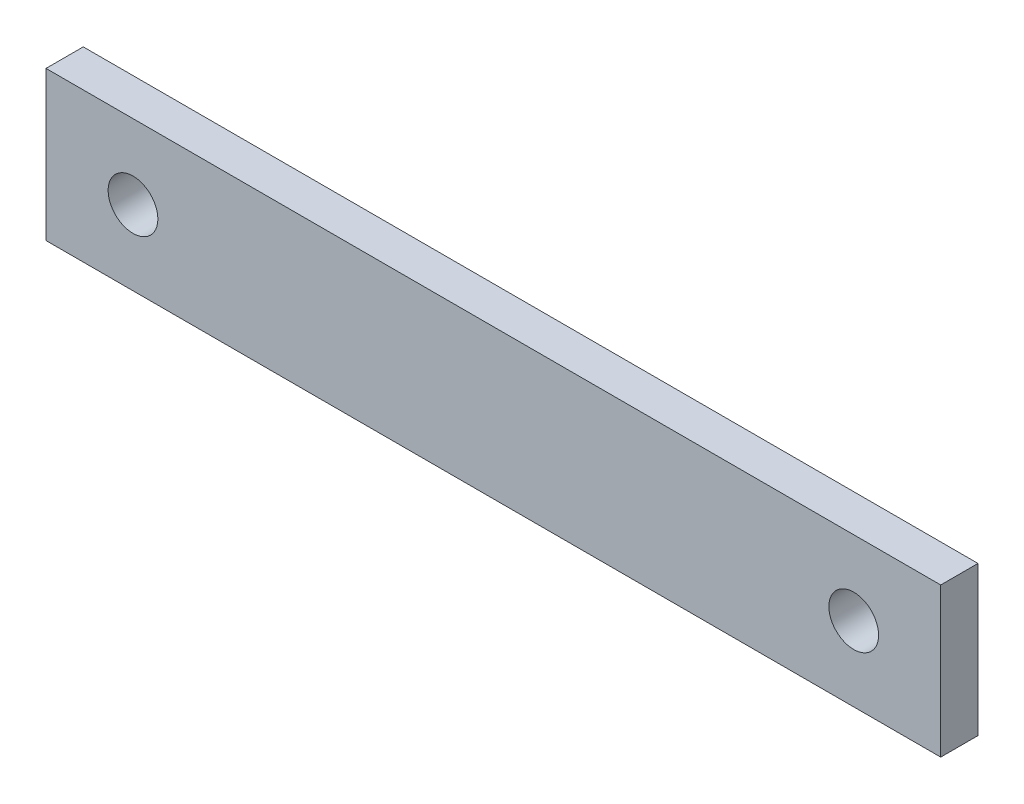
ISO-10303-21;
HEADER;
FILE_DESCRIPTION(('STEP AP214'),'2;1');
FILE_NAME('part.step','',(''),(''),'','','');
FILE_SCHEMA(('AUTOMOTIVE_DESIGN { 1 0 10303 214 1 1 1 1 }'));
ENDSEC;
DATA;
#1=APPLICATION_CONTEXT('core data for automotive mechanical design processes');
#2=APPLICATION_PROTOCOL_DEFINITION('international standard','automotive_design',2000,#1);
#3=PRODUCT_CONTEXT('',#1,'mechanical');
#4=PRODUCT('Part','Part','',(#3));
#5=PRODUCT_RELATED_PRODUCT_CATEGORY('part','',(#4));
#6=PRODUCT_DEFINITION_FORMATION('','',#4);
#7=PRODUCT_DEFINITION_CONTEXT('part definition',#1,'design');
#8=PRODUCT_DEFINITION('design','',#6,#7);
#9=PRODUCT_DEFINITION_SHAPE('','',#8);
#10=(LENGTH_UNIT() NAMED_UNIT(*) SI_UNIT(.MILLI.,.METRE.));
#11=(NAMED_UNIT(*) PLANE_ANGLE_UNIT() SI_UNIT($,.RADIAN.));
#12=(NAMED_UNIT(*) SI_UNIT($,.STERADIAN.) SOLID_ANGLE_UNIT());
#13=UNCERTAINTY_MEASURE_WITH_UNIT(LENGTH_MEASURE(1.E-05),#10,'distance_accuracy_value','');
#14=(GEOMETRIC_REPRESENTATION_CONTEXT(3) GLOBAL_UNCERTAINTY_ASSIGNED_CONTEXT((#13)) GLOBAL_UNIT_ASSIGNED_CONTEXT((#10,
#11,#12)) REPRESENTATION_CONTEXT('',''));
#15=CARTESIAN_POINT('',(0.,0.,0.));
#16=DIRECTION('',(0.,0.,1.));
#17=DIRECTION('',(1.,0.,0.));
#18=AXIS2_PLACEMENT_3D('',#15,#16,#17);
#19=CARTESIAN_POINT('',(-24.595022473353,4.43076923076923,1.8));
#20=DIRECTION('',(1.,0.,0.));
#21=DIRECTION('',(0.,0.,-1.));
#22=AXIS2_PLACEMENT_3D('',#19,#20,#21);
#23=PLANE('',#22);
#24=DIRECTION('',(0.,-1.,0.));
#25=VECTOR('',#24,1.);
#26=CARTESIAN_POINT('',(-24.595022473353,4.43076923076923,0.));
#27=LINE('',#26,#25);
#28=CARTESIAN_POINT('',(-24.595022473353,4.43076923076923,0.));
#29=VERTEX_POINT('',#28);
#30=CARTESIAN_POINT('',(-24.595022473353,-2.76923076923077,0.));
#31=VERTEX_POINT('',#30);
#32=EDGE_CURVE('E96',#29,#31,#27,.T.);
#33=ORIENTED_EDGE('',*,*,#32,.T.);
#34=DIRECTION('',(0.,0.,-1.));
#35=VECTOR('',#34,1.);
#36=CARTESIAN_POINT('',(-24.595022473353,-2.76923076923077,1.8));
#37=LINE('',#36,#35);
#38=CARTESIAN_POINT('',(-24.595022473353,-2.76923076923077,1.8));
#39=VERTEX_POINT('',#38);
#40=EDGE_CURVE('E11',#39,#31,#37,.T.);
#41=ORIENTED_EDGE('',*,*,#40,.F.);
#42=DIRECTION('',(0.,-1.,0.));
#43=VECTOR('',#42,1.);
#44=CARTESIAN_POINT('',(-24.595022473353,4.43076923076923,1.8));
#45=LINE('',#44,#43);
#46=CARTESIAN_POINT('',(-24.595022473353,4.43076923076923,1.8));
#47=VERTEX_POINT('',#46);
#48=EDGE_CURVE('E84',#47,#39,#45,.T.);
#49=ORIENTED_EDGE('',*,*,#48,.F.);
#50=DIRECTION('',(0.,0.,-1.));
#51=VECTOR('',#50,1.);
#52=CARTESIAN_POINT('',(-24.595022473353,4.43076923076923,1.8));
#53=LINE('',#52,#51);
#54=EDGE_CURVE('E92',#47,#29,#53,.T.);
#55=ORIENTED_EDGE('',*,*,#54,.T.);
#56=EDGE_LOOP('',(#33,#41,#49,#55));
#57=FACE_BOUND('',#56,.T.);
#58=ADVANCED_FACE('F33',(#57),#23,.F.);
#59=CARTESIAN_POINT('',(-24.595022473353,-2.76923076923077,1.8));
#60=DIRECTION('',(0.,1.,0.));
#61=DIRECTION('',(0.,0.,1.));
#62=AXIS2_PLACEMENT_3D('',#59,#60,#61);
#63=PLANE('',#62);
#64=DIRECTION('',(1.,0.,0.));
#65=VECTOR('',#64,1.);
#66=CARTESIAN_POINT('',(-24.595022473353,-2.76923076923077,0.));
#67=LINE('',#66,#65);
#68=CARTESIAN_POINT('',(18.604977526647,-2.76923076923077,0.));
#69=VERTEX_POINT('',#68);
#70=EDGE_CURVE('E88',#31,#69,#67,.T.);
#71=ORIENTED_EDGE('',*,*,#70,.T.);
#72=DIRECTION('',(0.,0.,-1.));
#73=VECTOR('',#72,1.);
#74=CARTESIAN_POINT('',(18.604977526647,-2.76923076923077,1.8));
#75=LINE('',#74,#73);
#76=CARTESIAN_POINT('',(18.604977526647,-2.76923076923077,1.8));
#77=VERTEX_POINT('',#76);
#78=EDGE_CURVE('E41',#77,#69,#75,.T.);
#79=ORIENTED_EDGE('',*,*,#78,.F.);
#80=DIRECTION('',(1.,0.,0.));
#81=VECTOR('',#80,1.);
#82=CARTESIAN_POINT('',(-24.595022473353,-2.76923076923077,1.8));
#83=LINE('',#82,#81);
#84=EDGE_CURVE('E79',#39,#77,#83,.T.);
#85=ORIENTED_EDGE('',*,*,#84,.F.);
#86=ORIENTED_EDGE('',*,*,#40,.T.);
#87=EDGE_LOOP('',(#71,#79,#85,#86));
#88=FACE_BOUND('',#87,.T.);
#89=ADVANCED_FACE('F87',(#88),#63,.F.);
#90=CARTESIAN_POINT('',(18.604977526647,-2.76923076923077,1.8));
#91=DIRECTION('',(-1.,0.,0.));
#92=DIRECTION('',(0.,0.,1.));
#93=AXIS2_PLACEMENT_3D('',#90,#91,#92);
#94=PLANE('',#93);
#95=DIRECTION('',(0.,1.,0.));
#96=VECTOR('',#95,1.);
#97=CARTESIAN_POINT('',(18.604977526647,-2.76923076923077,0.));
#98=LINE('',#97,#96);
#99=CARTESIAN_POINT('',(18.604977526647,4.43076923076923,0.));
#100=VERTEX_POINT('',#99);
#101=EDGE_CURVE('E66',#69,#100,#98,.T.);
#102=ORIENTED_EDGE('',*,*,#101,.T.);
#103=DIRECTION('',(0.,0.,-1.));
#104=VECTOR('',#103,1.);
#105=CARTESIAN_POINT('',(18.604977526647,4.43076923076923,1.8));
#106=LINE('',#105,#104);
#107=CARTESIAN_POINT('',(18.604977526647,4.43076923076923,1.8));
#108=VERTEX_POINT('',#107);
#109=EDGE_CURVE('E89',#108,#100,#106,.T.);
#110=ORIENTED_EDGE('',*,*,#109,.F.);
#111=DIRECTION('',(0.,1.,0.));
#112=VECTOR('',#111,1.);
#113=CARTESIAN_POINT('',(18.604977526647,-2.76923076923077,1.8));
#114=LINE('',#113,#112);
#115=EDGE_CURVE('E82',#77,#108,#114,.T.);
#116=ORIENTED_EDGE('',*,*,#115,.F.);
#117=ORIENTED_EDGE('',*,*,#78,.T.);
#118=EDGE_LOOP('',(#102,#110,#116,#117));
#119=FACE_BOUND('',#118,.T.);
#120=ADVANCED_FACE('F90',(#119),#94,.F.);
#121=CARTESIAN_POINT('',(-24.595022473353,4.43076923076923,1.8));
#122=DIRECTION('',(0.,-1.,0.));
#123=DIRECTION('',(0.,0.,-1.));
#124=AXIS2_PLACEMENT_3D('',#121,#122,#123);
#125=PLANE('',#124);
#126=DIRECTION('',(-1.,0.,0.));
#127=VECTOR('',#126,1.);
#128=CARTESIAN_POINT('',(-24.595022473353,4.43076923076923,0.));
#129=LINE('',#128,#127);
#130=EDGE_CURVE('E72',#100,#29,#129,.T.);
#131=ORIENTED_EDGE('',*,*,#130,.T.);
#132=ORIENTED_EDGE('',*,*,#54,.F.);
#133=DIRECTION('',(-1.,0.,0.));
#134=VECTOR('',#133,1.);
#135=CARTESIAN_POINT('',(-24.595022473353,4.43076923076923,1.8));
#136=LINE('',#135,#134);
#137=EDGE_CURVE('E49',#108,#47,#136,.T.);
#138=ORIENTED_EDGE('',*,*,#137,.F.);
#139=ORIENTED_EDGE('',*,*,#109,.T.);
#140=EDGE_LOOP('',(#131,#132,#138,#139));
#141=FACE_BOUND('',#140,.T.);
#142=ADVANCED_FACE('F104',(#141),#125,.F.);
#143=CARTESIAN_POINT('',(0.,0.,1.8));
#144=DIRECTION('',(0.,0.,1.));
#145=DIRECTION('',(1.,0.,0.));
#146=AXIS2_PLACEMENT_3D('',#143,#144,#145);
#147=PLANE('',#146);
#148=CARTESIAN_POINT('',(14.404977526647,0.830769230769224,1.8));
#149=DIRECTION('',(0.,0.,1.));
#150=DIRECTION('',(1.,0.,0.));
#151=AXIS2_PLACEMENT_3D('',#148,#149,#150);
#152=CIRCLE('',#151,1.2);
#153=CARTESIAN_POINT('',(15.604977526647,0.830769230769224,1.8));
#154=VERTEX_POINT('',#153);
#155=EDGE_CURVE('E99',#154,#154,#152,.T.);
#156=ORIENTED_EDGE('',*,*,#155,.F.);
#157=EDGE_LOOP('',(#156));
#158=FACE_BOUND('',#157,.T.);
#159=CARTESIAN_POINT('',(-20.395022473353,0.830769230769224,1.8));
#160=DIRECTION('',(0.,0.,1.));
#161=DIRECTION('',(-1.,0.,0.));
#162=AXIS2_PLACEMENT_3D('',#159,#160,#161);
#163=CIRCLE('',#162,1.2);
#164=CARTESIAN_POINT('',(-21.595022473353,0.830769230769224,1.8));
#165=VERTEX_POINT('',#164);
#166=EDGE_CURVE('E113',#165,#165,#163,.T.);
#167=ORIENTED_EDGE('',*,*,#166,.F.);
#168=EDGE_LOOP('',(#167));
#169=FACE_BOUND('',#168,.T.);
#170=ORIENTED_EDGE('',*,*,#48,.T.);
#171=ORIENTED_EDGE('',*,*,#84,.T.);
#172=ORIENTED_EDGE('',*,*,#115,.T.);
#173=ORIENTED_EDGE('',*,*,#137,.T.);
#174=EDGE_LOOP('',(#170,#171,#172,#173));
#175=FACE_BOUND('',#174,.T.);
#176=ADVANCED_FACE('F80',(#158,#169,#175),#147,.T.);
#177=CARTESIAN_POINT('',(0.,0.,0.));
#178=DIRECTION('',(0.,0.,1.));
#179=DIRECTION('',(1.,0.,0.));
#180=AXIS2_PLACEMENT_3D('',#177,#178,#179);
#181=PLANE('',#180);
#182=CARTESIAN_POINT('',(14.404977526647,0.830769230769224,0.));
#183=DIRECTION('',(0.,0.,1.));
#184=DIRECTION('',(1.,0.,0.));
#185=AXIS2_PLACEMENT_3D('',#182,#183,#184);
#186=CIRCLE('',#185,1.2);
#187=CARTESIAN_POINT('',(15.604977526647,0.830769230769224,0.));
#188=VERTEX_POINT('',#187);
#189=EDGE_CURVE('E116',#188,#188,#186,.T.);
#190=ORIENTED_EDGE('',*,*,#189,.T.);
#191=EDGE_LOOP('',(#190));
#192=FACE_BOUND('',#191,.T.);
#193=CARTESIAN_POINT('',(-20.395022473353,0.830769230769224,0.));
#194=DIRECTION('',(0.,0.,1.));
#195=DIRECTION('',(-1.,0.,0.));
#196=AXIS2_PLACEMENT_3D('',#193,#194,#195);
#197=CIRCLE('',#196,1.2);
#198=CARTESIAN_POINT('',(-21.595022473353,0.830769230769224,0.));
#199=VERTEX_POINT('',#198);
#200=EDGE_CURVE('E110',#199,#199,#197,.T.);
#201=ORIENTED_EDGE('',*,*,#200,.T.);
#202=EDGE_LOOP('',(#201));
#203=FACE_BOUND('',#202,.T.);
#204=ORIENTED_EDGE('',*,*,#32,.F.);
#205=ORIENTED_EDGE('',*,*,#130,.F.);
#206=ORIENTED_EDGE('',*,*,#101,.F.);
#207=ORIENTED_EDGE('',*,*,#70,.F.);
#208=EDGE_LOOP('',(#204,#205,#206,#207));
#209=FACE_BOUND('',#208,.T.);
#210=ADVANCED_FACE('F107',(#192,#203,#209),#181,.F.);
#211=CARTESIAN_POINT('',(-20.395022473353,0.830769230769224,1.8));
#212=DIRECTION('',(0.,0.,-1.));
#213=DIRECTION('',(-1.,0.,0.));
#214=AXIS2_PLACEMENT_3D('',#211,#212,#213);
#215=CYLINDRICAL_SURFACE('',#214,1.2);
#216=ORIENTED_EDGE('',*,*,#166,.T.);
#217=EDGE_LOOP('',(#216));
#218=FACE_BOUND('',#217,.T.);
#219=ORIENTED_EDGE('',*,*,#200,.F.);
#220=EDGE_LOOP('',(#219));
#221=FACE_BOUND('',#220,.T.);
#222=ADVANCED_FACE('F130',(#218,#221),#215,.F.);
#223=CARTESIAN_POINT('',(14.404977526647,0.830769230769224,1.8));
#224=DIRECTION('',(0.,0.,-1.));
#225=DIRECTION('',(-1.,0.,0.));
#226=AXIS2_PLACEMENT_3D('',#223,#224,#225);
#227=CYLINDRICAL_SURFACE('',#226,1.2);
#228=ORIENTED_EDGE('',*,*,#155,.T.);
#229=EDGE_LOOP('',(#228));
#230=FACE_BOUND('',#229,.T.);
#231=ORIENTED_EDGE('',*,*,#189,.F.);
#232=EDGE_LOOP('',(#231));
#233=FACE_BOUND('',#232,.T.);
#234=ADVANCED_FACE('F122',(#230,#233),#227,.F.);
#235=CLOSED_SHELL('',(#58,#89,#120,#142,#176,#210,#222,#234));
#236=MANIFOLD_SOLID_BREP('B2',#235);
#237=ADVANCED_BREP_SHAPE_REPRESENTATION('',(#18,#236),#14);
#238=SHAPE_DEFINITION_REPRESENTATION(#9,#237);
ENDSEC;
END-ISO-10303-21;
